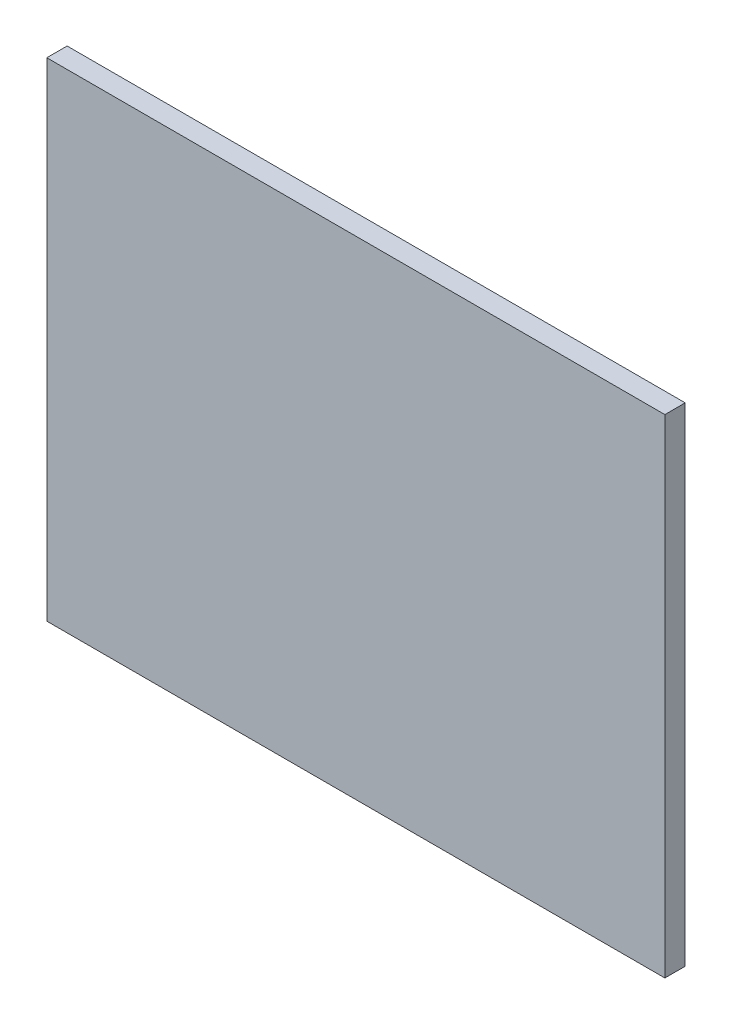
ISO-10303-21;
HEADER;
FILE_DESCRIPTION(('STEP AP214'),'2;1');
FILE_NAME('part.step','',(''),(''),'','','');
FILE_SCHEMA(('AUTOMOTIVE_DESIGN { 1 0 10303 214 1 1 1 1 }'));
ENDSEC;
DATA;
#1=APPLICATION_CONTEXT('core data for automotive mechanical design processes');
#2=APPLICATION_PROTOCOL_DEFINITION('international standard','automotive_design',2000,#1);
#3=PRODUCT_CONTEXT('',#1,'mechanical');
#4=PRODUCT('Part','Part','',(#3));
#5=PRODUCT_RELATED_PRODUCT_CATEGORY('part','',(#4));
#6=PRODUCT_DEFINITION_FORMATION('','',#4);
#7=PRODUCT_DEFINITION_CONTEXT('part definition',#1,'design');
#8=PRODUCT_DEFINITION('design','',#6,#7);
#9=PRODUCT_DEFINITION_SHAPE('','',#8);
#10=(LENGTH_UNIT() NAMED_UNIT(*) SI_UNIT(.MILLI.,.METRE.));
#11=(NAMED_UNIT(*) PLANE_ANGLE_UNIT() SI_UNIT($,.RADIAN.));
#12=(NAMED_UNIT(*) SI_UNIT($,.STERADIAN.) SOLID_ANGLE_UNIT());
#13=UNCERTAINTY_MEASURE_WITH_UNIT(LENGTH_MEASURE(1.E-05),#10,'distance_accuracy_value','');
#14=(GEOMETRIC_REPRESENTATION_CONTEXT(3) GLOBAL_UNCERTAINTY_ASSIGNED_CONTEXT((#13)) GLOBAL_UNIT_ASSIGNED_CONTEXT((#10,
#11,#12)) REPRESENTATION_CONTEXT('',''));
#15=CARTESIAN_POINT('',(0.,0.,0.));
#16=DIRECTION('',(0.,0.,1.));
#17=DIRECTION('',(1.,0.,0.));
#18=AXIS2_PLACEMENT_3D('',#15,#16,#17);
#19=CARTESIAN_POINT('',(0.,0.,2.5));
#20=DIRECTION('',(1.,0.,0.));
#21=DIRECTION('',(0.,1.,0.));
#22=AXIS2_PLACEMENT_3D('',#19,#20,#21);
#23=PLANE('',#22);
#24=DIRECTION('',(0.,-1.,0.));
#25=VECTOR('',#24,1.);
#26=CARTESIAN_POINT('',(0.,0.,0.));
#27=LINE('',#26,#25);
#28=CARTESIAN_POINT('',(0.,0.,0.));
#29=VERTEX_POINT('',#28);
#30=CARTESIAN_POINT('',(0.,-60.,0.));
#31=VERTEX_POINT('',#30);
#32=EDGE_CURVE('E102',#29,#31,#27,.T.);
#33=ORIENTED_EDGE('',*,*,#32,.T.);
#34=DIRECTION('',(0.,0.,-1.));
#35=VECTOR('',#34,1.);
#36=CARTESIAN_POINT('',(0.,-60.,2.5));
#37=LINE('',#36,#35);
#38=CARTESIAN_POINT('',(0.,-60.,2.5));
#39=VERTEX_POINT('',#38);
#40=EDGE_CURVE('E11',#39,#31,#37,.T.);
#41=ORIENTED_EDGE('',*,*,#40,.F.);
#42=DIRECTION('',(0.,-1.,0.));
#43=VECTOR('',#42,1.);
#44=CARTESIAN_POINT('',(0.,0.,2.5));
#45=LINE('',#44,#43);
#46=CARTESIAN_POINT('',(0.,0.,2.5));
#47=VERTEX_POINT('',#46);
#48=EDGE_CURVE('E90',#47,#39,#45,.T.);
#49=ORIENTED_EDGE('',*,*,#48,.F.);
#50=DIRECTION('',(0.,0.,-1.));
#51=VECTOR('',#50,1.);
#52=CARTESIAN_POINT('',(0.,0.,2.5));
#53=LINE('',#52,#51);
#54=EDGE_CURVE('E98',#47,#29,#53,.T.);
#55=ORIENTED_EDGE('',*,*,#54,.T.);
#56=EDGE_LOOP('',(#33,#41,#49,#55));
#57=FACE_BOUND('',#56,.T.);
#58=ADVANCED_FACE('F39',(#57),#23,.F.);
#59=CARTESIAN_POINT('',(0.,-60.,2.5));
#60=DIRECTION('',(0.,1.,0.));
#61=DIRECTION('',(0.,0.,1.));
#62=AXIS2_PLACEMENT_3D('',#59,#60,#61);
#63=PLANE('',#62);
#64=DIRECTION('',(1.,0.,0.));
#65=VECTOR('',#64,1.);
#66=CARTESIAN_POINT('',(0.,-60.,0.));
#67=LINE('',#66,#65);
#68=CARTESIAN_POINT('',(76.,-60.,0.));
#69=VERTEX_POINT('',#68);
#70=EDGE_CURVE('E94',#31,#69,#67,.T.);
#71=ORIENTED_EDGE('',*,*,#70,.T.);
#72=DIRECTION('',(0.,0.,-1.));
#73=VECTOR('',#72,1.);
#74=CARTESIAN_POINT('',(76.,-60.,2.5));
#75=LINE('',#74,#73);
#76=CARTESIAN_POINT('',(76.,-60.,2.5));
#77=VERTEX_POINT('',#76);
#78=EDGE_CURVE('E47',#77,#69,#75,.T.);
#79=ORIENTED_EDGE('',*,*,#78,.F.);
#80=DIRECTION('',(1.,0.,0.));
#81=VECTOR('',#80,1.);
#82=CARTESIAN_POINT('',(0.,-60.,2.5));
#83=LINE('',#82,#81);
#84=EDGE_CURVE('E85',#39,#77,#83,.T.);
#85=ORIENTED_EDGE('',*,*,#84,.F.);
#86=ORIENTED_EDGE('',*,*,#40,.T.);
#87=EDGE_LOOP('',(#71,#79,#85,#86));
#88=FACE_BOUND('',#87,.T.);
#89=ADVANCED_FACE('F93',(#88),#63,.F.);
#90=CARTESIAN_POINT('',(76.,0.,2.5));
#91=DIRECTION('',(-1.,0.,0.));
#92=DIRECTION('',(0.,-1.,0.));
#93=AXIS2_PLACEMENT_3D('',#90,#91,#92);
#94=PLANE('',#93);
#95=DIRECTION('',(0.,1.,0.));
#96=VECTOR('',#95,1.);
#97=CARTESIAN_POINT('',(76.,0.,0.));
#98=LINE('',#97,#96);
#99=CARTESIAN_POINT('',(76.,0.,0.));
#100=VERTEX_POINT('',#99);
#101=EDGE_CURVE('E72',#69,#100,#98,.T.);
#102=ORIENTED_EDGE('',*,*,#101,.T.);
#103=DIRECTION('',(0.,0.,-1.));
#104=VECTOR('',#103,1.);
#105=CARTESIAN_POINT('',(76.,0.,2.5));
#106=LINE('',#105,#104);
#107=CARTESIAN_POINT('',(76.,0.,2.5));
#108=VERTEX_POINT('',#107);
#109=EDGE_CURVE('E95',#108,#100,#106,.T.);
#110=ORIENTED_EDGE('',*,*,#109,.F.);
#111=DIRECTION('',(0.,1.,0.));
#112=VECTOR('',#111,1.);
#113=CARTESIAN_POINT('',(76.,0.,2.5));
#114=LINE('',#113,#112);
#115=EDGE_CURVE('E88',#77,#108,#114,.T.);
#116=ORIENTED_EDGE('',*,*,#115,.F.);
#117=ORIENTED_EDGE('',*,*,#78,.T.);
#118=EDGE_LOOP('',(#102,#110,#116,#117));
#119=FACE_BOUND('',#118,.T.);
#120=ADVANCED_FACE('F96',(#119),#94,.F.);
#121=CARTESIAN_POINT('',(0.,0.,2.5));
#122=DIRECTION('',(0.,-1.,0.));
#123=DIRECTION('',(0.,0.,-1.));
#124=AXIS2_PLACEMENT_3D('',#121,#122,#123);
#125=PLANE('',#124);
#126=DIRECTION('',(-1.,0.,0.));
#127=VECTOR('',#126,1.);
#128=CARTESIAN_POINT('',(0.,0.,0.));
#129=LINE('',#128,#127);
#130=EDGE_CURVE('E78',#100,#29,#129,.T.);
#131=ORIENTED_EDGE('',*,*,#130,.T.);
#132=ORIENTED_EDGE('',*,*,#54,.F.);
#133=DIRECTION('',(-1.,0.,0.));
#134=VECTOR('',#133,1.);
#135=CARTESIAN_POINT('',(0.,0.,2.5));
#136=LINE('',#135,#134);
#137=EDGE_CURVE('E55',#108,#47,#136,.T.);
#138=ORIENTED_EDGE('',*,*,#137,.F.);
#139=ORIENTED_EDGE('',*,*,#109,.T.);
#140=EDGE_LOOP('',(#131,#132,#138,#139));
#141=FACE_BOUND('',#140,.T.);
#142=ADVANCED_FACE('F109',(#141),#125,.F.);
#143=CARTESIAN_POINT('',(0.,0.,2.5));
#144=DIRECTION('',(0.,0.,1.));
#145=DIRECTION('',(1.,0.,0.));
#146=AXIS2_PLACEMENT_3D('',#143,#144,#145);
#147=PLANE('',#146);
#148=ORIENTED_EDGE('',*,*,#48,.T.);
#149=ORIENTED_EDGE('',*,*,#84,.T.);
#150=ORIENTED_EDGE('',*,*,#115,.T.);
#151=ORIENTED_EDGE('',*,*,#137,.T.);
#152=EDGE_LOOP('',(#148,#149,#150,#151));
#153=FACE_BOUND('',#152,.T.);
#154=ADVANCED_FACE('F86',(#153),#147,.T.);
#155=CARTESIAN_POINT('',(0.,0.,0.));
#156=DIRECTION('',(0.,0.,1.));
#157=DIRECTION('',(1.,0.,0.));
#158=AXIS2_PLACEMENT_3D('',#155,#156,#157);
#159=PLANE('',#158);
#160=ORIENTED_EDGE('',*,*,#32,.F.);
#161=ORIENTED_EDGE('',*,*,#130,.F.);
#162=ORIENTED_EDGE('',*,*,#101,.F.);
#163=ORIENTED_EDGE('',*,*,#70,.F.);
#164=EDGE_LOOP('',(#160,#161,#162,#163));
#165=FACE_BOUND('',#164,.T.);
#166=ADVANCED_FACE('F112',(#165),#159,.F.);
#167=CLOSED_SHELL('',(#58,#89,#120,#142,#154,#166));
#168=MANIFOLD_SOLID_BREP('B2',#167);
#169=ADVANCED_BREP_SHAPE_REPRESENTATION('',(#18,#168),#14);
#170=SHAPE_DEFINITION_REPRESENTATION(#9,#169);
ENDSEC;
END-ISO-10303-21;
